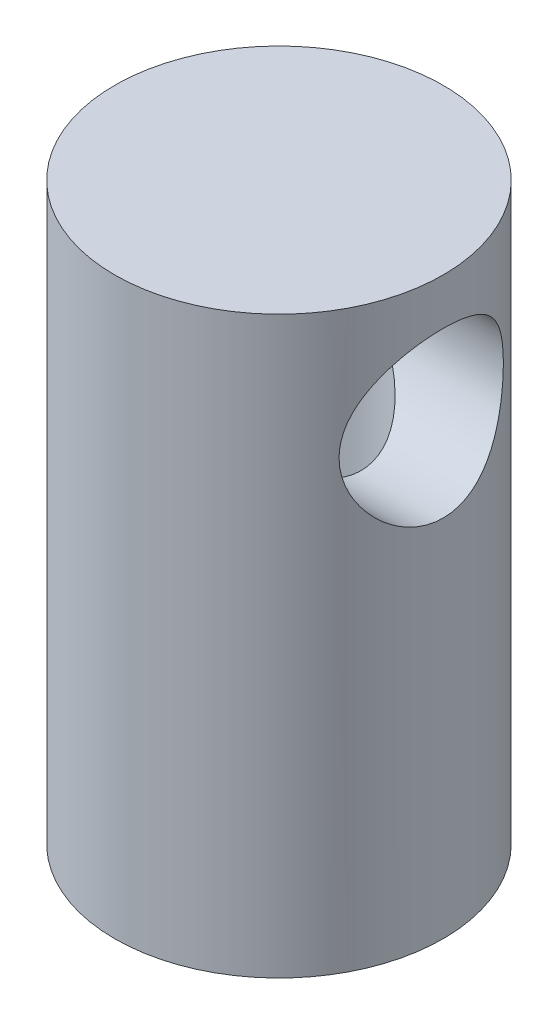
ISO-10303-21;
HEADER;
FILE_DESCRIPTION(('STEP AP214'),'2;1');
FILE_NAME('part.step','',(''),(''),'','','');
FILE_SCHEMA(('AUTOMOTIVE_DESIGN { 1 0 10303 214 1 1 1 1 }'));
ENDSEC;
DATA;
#1=APPLICATION_CONTEXT('core data for automotive mechanical design processes');
#2=APPLICATION_PROTOCOL_DEFINITION('international standard','automotive_design',2000,#1);
#3=PRODUCT_CONTEXT('',#1,'mechanical');
#4=PRODUCT('Part','Part','',(#3));
#5=PRODUCT_RELATED_PRODUCT_CATEGORY('part','',(#4));
#6=PRODUCT_DEFINITION_FORMATION('','',#4);
#7=PRODUCT_DEFINITION_CONTEXT('part definition',#1,'design');
#8=PRODUCT_DEFINITION('design','',#6,#7);
#9=PRODUCT_DEFINITION_SHAPE('','',#8);
#10=(LENGTH_UNIT() NAMED_UNIT(*) SI_UNIT(.MILLI.,.METRE.));
#11=(NAMED_UNIT(*) PLANE_ANGLE_UNIT() SI_UNIT($,.RADIAN.));
#12=(NAMED_UNIT(*) SI_UNIT($,.STERADIAN.) SOLID_ANGLE_UNIT());
#13=UNCERTAINTY_MEASURE_WITH_UNIT(LENGTH_MEASURE(1.E-05),#10,'distance_accuracy_value','');
#14=(GEOMETRIC_REPRESENTATION_CONTEXT(3) GLOBAL_UNCERTAINTY_ASSIGNED_CONTEXT((#13)) GLOBAL_UNIT_ASSIGNED_CONTEXT((#10,
#11,#12)) REPRESENTATION_CONTEXT('',''));
#15=CARTESIAN_POINT('',(0.,0.,0.));
#16=DIRECTION('',(0.,0.,1.));
#17=DIRECTION('',(1.,0.,0.));
#18=AXIS2_PLACEMENT_3D('',#15,#16,#17);
#19=CARTESIAN_POINT('',(0.,21.,0.));
#20=DIRECTION('',(0.,-1.,0.));
#21=DIRECTION('',(0.,0.,-1.));
#22=AXIS2_PLACEMENT_3D('',#19,#20,#21);
#23=CYLINDRICAL_SURFACE('',#22,6.);
#24=CARTESIAN_POINT('',(0.,21.,0.));
#25=DIRECTION('',(0.,1.,0.));
#26=DIRECTION('',(0.,0.,1.));
#27=AXIS2_PLACEMENT_3D('',#24,#25,#26);
#28=CIRCLE('',#27,6.);
#29=CARTESIAN_POINT('',(0.,21.,6.));
#30=VERTEX_POINT('',#29);
#31=EDGE_CURVE('E63',#30,#30,#28,.T.);
#32=ORIENTED_EDGE('',*,*,#31,.F.);
#33=EDGE_LOOP('',(#32));
#34=FACE_BOUND('',#33,.T.);
#35=CARTESIAN_POINT('',(0.,0.,0.));
#36=DIRECTION('',(0.,1.,0.));
#37=DIRECTION('',(0.,0.,1.));
#38=AXIS2_PLACEMENT_3D('',#35,#36,#37);
#39=CIRCLE('',#38,6.);
#40=CARTESIAN_POINT('',(0.,0.,6.));
#41=VERTEX_POINT('',#40);
#42=EDGE_CURVE('E75',#41,#41,#39,.T.);
#43=ORIENTED_EDGE('',*,*,#42,.T.);
#44=EDGE_LOOP('',(#43));
#45=FACE_BOUND('',#44,.T.);
#46=CARTESIAN_POINT('',(-5.19615242270663,16.3094313476554,3.));
#47=CARTESIAN_POINT('',(-5.19615338151414,16.3876315809145,2.99999910875738));
#48=CARTESIAN_POINT('',(-5.19792581191127,16.46584134612,2.99693611207795));
#49=CARTESIAN_POINT('',(-5.20493931657122,16.6216394227975,2.98473565374509));
#50=CARTESIAN_POINT('',(-5.21018200566082,16.6992274279239,2.97559536411629));
#51=CARTESIAN_POINT('',(-5.23088200558207,16.9303753619019,2.9391691225804));
#52=CARTESIAN_POINT('',(-5.25131076607215,17.0821822581887,2.902878058149));
#53=CARTESIAN_POINT('',(-5.30247746927539,17.375822981179,2.80829998089522));
#54=CARTESIAN_POINT('',(-5.33316051577918,17.5177051494063,2.75012989346617));
#55=CARTESIAN_POINT('',(-5.40128072966972,17.7896941093563,2.61380253964662));
#56=CARTESIAN_POINT('',(-5.43871826241347,17.9198002635304,2.53564419197537));
#57=CARTESIAN_POINT('',(-5.51990583559837,18.1763514938032,2.35399963256537));
#58=CARTESIAN_POINT('',(-5.5639218457163,18.3016095498114,2.24895611137364));
#59=CARTESIAN_POINT('',(-5.65115954702499,18.533655717345,2.01976141989962));
#60=CARTESIAN_POINT('',(-5.6943808324562,18.6404346159121,1.89560077655245));
#61=CARTESIAN_POINT('',(-5.77864428988887,18.8395330353878,1.62146869109162));
#62=CARTESIAN_POINT('',(-5.81934318752245,18.9303927135827,1.47032156718994));
#63=CARTESIAN_POINT('',(-5.89052268800541,19.0848538450835,1.1524710796464));
#64=CARTESIAN_POINT('',(-5.92100973690811,19.148472500902,0.985777614653094));
#65=CARTESIAN_POINT('',(-5.96641383603058,19.2419453456446,0.654134831556287));
#66=CARTESIAN_POINT('',(-5.98228440595573,19.2738799273035,0.489905370480169));
#67=CARTESIAN_POINT('',(-6.00022751605263,19.3099297030995,0.157711887079233));
#68=CARTESIAN_POINT('',(-6.00230840492438,19.3140617297877,-0.0102498138110356));
#69=CARTESIAN_POINT('',(-5.9928894562274,19.2951913150206,-0.329497576667919));
#70=CARTESIAN_POINT('',(-5.98255487247965,19.2745172595774,-0.480963609704589));
#71=CARTESIAN_POINT('',(-5.9512273620779,19.210788857459,-0.77794130357984));
#72=CARTESIAN_POINT('',(-5.93023363786807,19.1677328360776,-0.923452517976628));
#73=CARTESIAN_POINT('',(-5.87914748253371,19.0601834918859,-1.20692822064062));
#74=CARTESIAN_POINT('',(-5.8489331854518,18.9954018164548,-1.34476044303001));
#75=CARTESIAN_POINT('',(-5.78212944004645,18.8466416909475,-1.60793023199368));
#76=CARTESIAN_POINT('',(-5.74553771044373,18.7626563681458,-1.73326330217191));
#77=CARTESIAN_POINT('',(-5.66533158492101,18.5687428737159,-1.98052168794677));
#78=CARTESIAN_POINT('',(-5.62138031742825,18.4571128370138,-2.10100497271934));
#79=CARTESIAN_POINT('',(-5.53363118085844,18.2156716057466,-2.32231036115798));
#80=CARTESIAN_POINT('',(-5.48983345502612,18.0858465537598,-2.42311733790258));
#81=CARTESIAN_POINT('',(-5.40432084665524,17.8014492043147,-2.6085269546345));
#82=CARTESIAN_POINT('',(-5.36291485750666,17.6458289120095,-2.691694028528));
#83=CARTESIAN_POINT('',(-5.30915194408666,17.4018682930437,-2.79542837524198));
#84=CARTESIAN_POINT('',(-5.29261946495429,17.3187750372507,-2.82650797342001));
#85=CARTESIAN_POINT('',(-5.26298473463269,17.149622744621,-2.88131297532033));
#86=CARTESIAN_POINT('',(-5.24988036897854,17.0635655731807,-2.90504291399185));
#87=CARTESIAN_POINT('',(-5.22855455988393,16.8960597274314,-2.94323927983804));
#88=CARTESIAN_POINT('',(-5.22002982263214,16.8147819220176,-2.95828810706486));
#89=CARTESIAN_POINT('',(-5.2067273715729,16.6509961089896,-2.98163903200842));
#90=CARTESIAN_POINT('',(-5.20194770920408,16.5684887639071,-2.98994463830254));
#91=CARTESIAN_POINT('',(-5.19633662863607,16.4029603408527,-2.99968663811345));
#92=CARTESIAN_POINT('',(-5.19550374026212,16.3199394657118,-3.00112558946313));
#93=CARTESIAN_POINT('',(-5.19780953199967,16.1541448868908,-2.99712742537403));
#94=CARTESIAN_POINT('',(-5.20094794403249,16.0713711669049,-2.99169077406597));
#95=CARTESIAN_POINT('',(-5.21504493010247,15.8425722116128,-2.96710135231213));
#96=CARTESIAN_POINT('',(-5.23019160660498,15.6975205373922,-2.9405616310018));
#97=CARTESIAN_POINT('',(-5.27081666384497,15.4143004368586,-2.86709067362229));
#98=CARTESIAN_POINT('',(-5.29629839028765,15.2761342558252,-2.82015283383764));
#99=CARTESIAN_POINT('',(-5.35608780273032,15.0032052437355,-2.70494224478442));
#100=CARTESIAN_POINT('',(-5.3907496041273,14.8688964197513,-2.63578205088436));
#101=CARTESIAN_POINT('',(-5.46468327792416,14.6130214092894,-2.47886133231338));
#102=CARTESIAN_POINT('',(-5.50395751387985,14.491461816844,-2.39109125263821));
#103=CARTESIAN_POINT('',(-5.58864005140301,14.2484957210236,-2.18651145695799));
#104=CARTESIAN_POINT('',(-5.63419752084737,14.1290400767554,-2.067435804994));
#105=CARTESIAN_POINT('',(-5.72202702310923,13.9111944523606,-1.8102134981498));
#106=CARTESIAN_POINT('',(-5.76429794308224,13.8128115879799,-1.67206042712515));
#107=CARTESIAN_POINT('',(-5.84224085806641,13.6377102200818,-1.37560608443379));
#108=CARTESIAN_POINT('',(-5.87770925226882,13.5616320057724,-1.21686929217556));
#109=CARTESIAN_POINT('',(-5.93650064667293,13.4380176233448,-0.886567094469552));
#110=CARTESIAN_POINT('',(-5.95983430919532,13.3904563928135,-0.715013103124011));
#111=CARTESIAN_POINT('',(-5.9900252464518,13.3293256558063,-0.380939047947201));
#112=CARTESIAN_POINT('',(-5.99819783930701,13.3130377120947,-0.219034335650394));
#113=CARTESIAN_POINT('',(-6.00126390919338,13.3069015592219,0.105377961951196));
#114=CARTESIAN_POINT('',(-5.99616203476053,13.3170440944723,0.267885316317457));
#115=CARTESIAN_POINT('',(-5.97401907190636,13.3616805377889,0.577613962536138));
#116=CARTESIAN_POINT('',(-5.95778686442443,13.3945257853211,0.725136901247722));
#117=CARTESIAN_POINT('',(-5.91576278551446,13.4814124556875,1.01233790874441));
#118=CARTESIAN_POINT('',(-5.88996954319456,13.5354569181979,1.15201484923628));
#119=CARTESIAN_POINT('',(-5.829778017116,13.6656120763442,1.42627001605163));
#120=CARTESIAN_POINT('',(-5.79505887623287,13.7425676891917,1.56037465678411));
#121=CARTESIAN_POINT('',(-5.72064363382009,13.915306769069,1.81432469711303));
#122=CARTESIAN_POINT('',(-5.6809452494399,14.0110988836442,1.93416350676913));
#123=CARTESIAN_POINT('',(-5.59585978819439,14.229816070139,2.16873884087782));
#124=CARTESIAN_POINT('',(-5.55029975504518,14.354492668429,2.28178066887875));
#125=CARTESIAN_POINT('',(-5.46188649509677,14.6218096757256,2.48600225783028));
#126=CARTESIAN_POINT('',(-5.41903568750872,14.7644658086865,2.57716267726705));
#127=CARTESIAN_POINT('',(-5.36004774906988,14.9919631409572,2.69665559342489));
#128=CARTESIAN_POINT('',(-5.34101219148464,15.0714071486379,2.73405408762355));
#129=CARTESIAN_POINT('',(-5.30572783063718,15.2337846306642,2.80191257626505));
#130=CARTESIAN_POINT('',(-5.28947759301443,15.3167162814034,2.83237614466584));
#131=CARTESIAN_POINT('',(-5.26045215868185,15.4852760800252,2.88592624586958));
#132=CARTESIAN_POINT('',(-5.24766803509091,15.5708966548968,2.90903175649394));
#133=CARTESIAN_POINT('',(-5.22608869625112,15.7442866029697,2.9476242805163));
#134=CARTESIAN_POINT('',(-5.21729069243665,15.8320544285761,2.96311662049621));
#135=CARTESIAN_POINT('',(-5.20588528016133,15.9848301654154,2.9830938122572));
#136=CARTESIAN_POINT('',(-5.20224442588138,16.0495261565624,2.9894274622838));
#137=CARTESIAN_POINT('',(-5.19737751744686,16.1792896644551,2.99788106792142));
#138=CARTESIAN_POINT('',(-5.1961516248372,16.244357205763,3.00000074164547));
#139=CARTESIAN_POINT('',(-5.19615242270663,16.3094313476554,3.));
#140=B_SPLINE_CURVE_WITH_KNOTS('',3,(#46,#47,#48,#49,#50,#51,#52,#53,#54,#55,#56,#57,#58,#59,
#60,#61,#62,#63,#64,#65,#66,#67,#68,#69,#70,#71,#72,#73,#74,#75,#76,#77,#78,#79,#80,#81,#82,#83,
#84,#85,#86,#87,#88,#89,#90,#91,#92,#93,#94,#95,#96,#97,#98,#99,#100,#101,#102,#103,#104,#105,
#106,#107,#108,#109,#110,#111,#112,#113,#114,#115,#116,#117,#118,#119,#120,#121,#122,#123,#124,
#125,#126,#127,#128,#129,#130,#131,#132,#133,#134,#135,#136,#137,#138,#139),.UNSPECIFIED.,.T.,
.F.,(4,2,2,2,2,2,2,2,2,2,2,2,2,2,2,2,2,2,2,2,2,2,2,2,2,2,2,2,2,2,2,2,2,2,2,2,2,2,2,2,2,2,2,2,2,
2,4),(0.,0.23452943073389,0.469168072604263,0.938850383294531,1.40605749261242,1.87328988121657,
2.37905864237582,2.88507883741224,3.42520847204402,3.96499651379784,4.46637625391917,
4.96745241546231,5.42495462941727,5.88249108040477,6.34635774681552,6.81039068538927,
7.31828744858784,7.82657315225867,8.36713695676456,8.63752916119813,8.90775419202327,
9.15669600787592,9.40550821320572,9.65422772860784,9.90293045534218,10.3454331624118,
10.7880792327729,11.2512265518736,11.7146122462924,12.2364099671094,12.7583836090371,
13.29413310208,13.8294110539541,14.3155757713756,14.8015702635101,15.2555404058358,
15.7095756650514,16.1830301812751,16.6567025627126,17.177514915193,17.6987859450456,
17.9680115893229,18.2370981707631,18.5054849980179,18.7736837791728,18.9688338446807,
19.1639969639894),.UNSPECIFIED.);
#141=CARTESIAN_POINT('',(-5.19615242270663,16.3094313476554,3.));
#142=VERTEX_POINT('',#141);
#143=EDGE_CURVE('E70',#142,#142,#140,.T.);
#144=ORIENTED_EDGE('',*,*,#143,.F.);
#145=EDGE_LOOP('',(#144));
#146=FACE_BOUND('',#145,.T.);
#147=CARTESIAN_POINT('',(5.19615242270663,16.3094313476554,3.));
#148=CARTESIAN_POINT('',(5.19615338151414,16.2312311143963,2.99999910875738));
#149=CARTESIAN_POINT('',(5.19792581191126,16.1530213491909,2.99693611207795));
#150=CARTESIAN_POINT('',(5.20493931657122,15.9972232725134,2.98473565374509));
#151=CARTESIAN_POINT('',(5.21018200566082,15.9196352673869,2.97559536411629));
#152=CARTESIAN_POINT('',(5.23088200558207,15.688487333409,2.9391691225804));
#153=CARTESIAN_POINT('',(5.25131076607215,15.5366804371222,2.902878058149));
#154=CARTESIAN_POINT('',(5.30247746927539,15.2430397141319,2.80829998089522));
#155=CARTESIAN_POINT('',(5.33316051577918,15.1011575459045,2.75012989346617));
#156=CARTESIAN_POINT('',(5.40128072966972,14.8291685859546,2.61380253964662));
#157=CARTESIAN_POINT('',(5.43871826241347,14.6990624317805,2.53564419197538));
#158=CARTESIAN_POINT('',(5.51990583559837,14.4425112015077,2.35399963256537));
#159=CARTESIAN_POINT('',(5.56392184571631,14.3172531454995,2.24895611137363));
#160=CARTESIAN_POINT('',(5.651159547025,14.0852069779659,2.01976141989962));
#161=CARTESIAN_POINT('',(5.6943808324562,13.9784280793987,1.89560077655245));
#162=CARTESIAN_POINT('',(5.77864428988887,13.7793296599231,1.62146869109162));
#163=CARTESIAN_POINT('',(5.81934318752245,13.6884699817282,1.47032156718994));
#164=CARTESIAN_POINT('',(5.89052268800541,13.5340088502274,1.15247107964639));
#165=CARTESIAN_POINT('',(5.92100973690811,13.4703901944089,0.985777614653093));
#166=CARTESIAN_POINT('',(5.96641383603058,13.3769173496663,0.654134831556286));
#167=CARTESIAN_POINT('',(5.98228440595573,13.3449827680074,0.489905370480168));
#168=CARTESIAN_POINT('',(6.00022751605263,13.3089329922114,0.157711887079233));
#169=CARTESIAN_POINT('',(6.00230840492438,13.3048009655232,-0.0102498138110356));
#170=CARTESIAN_POINT('',(5.9928894562274,13.3236713802902,-0.329497576667918));
#171=CARTESIAN_POINT('',(5.98255487247965,13.3443454357335,-0.480963609704588));
#172=CARTESIAN_POINT('',(5.9512273620779,13.4080738378519,-0.77794130357984));
#173=CARTESIAN_POINT('',(5.93023363786807,13.4511298592333,-0.923452517976629));
#174=CARTESIAN_POINT('',(5.87914748253371,13.558679203425,-1.20692822064062));
#175=CARTESIAN_POINT('',(5.8489331854518,13.6234608788561,-1.34476044303001));
#176=CARTESIAN_POINT('',(5.78212944004645,13.7722210043634,-1.60793023199368));
#177=CARTESIAN_POINT('',(5.74553771044373,13.8562063271651,-1.73326330217191));
#178=CARTESIAN_POINT('',(5.66533158492101,14.050119821595,-1.98052168794677));
#179=CARTESIAN_POINT('',(5.62138031742825,14.1617498582971,-2.10100497271934));
#180=CARTESIAN_POINT('',(5.53363118085844,14.4031910895643,-2.32231036115798));
#181=CARTESIAN_POINT('',(5.48983345502612,14.5330161415511,-2.42311733790258));
#182=CARTESIAN_POINT('',(5.40432084665524,14.8174134909962,-2.6085269546345));
#183=CARTESIAN_POINT('',(5.36291485750666,14.9730337833014,-2.691694028528));
#184=CARTESIAN_POINT('',(5.30915194408666,15.2169944022672,-2.79542837524198));
#185=CARTESIAN_POINT('',(5.29261946495429,15.3000876580602,-2.82650797342001));
#186=CARTESIAN_POINT('',(5.26298473463269,15.4692399506899,-2.88131297532033));
#187=CARTESIAN_POINT('',(5.24988036897854,15.5552971221302,-2.90504291399185));
#188=CARTESIAN_POINT('',(5.22855455988393,15.7228029678795,-2.94323927983804));
#189=CARTESIAN_POINT('',(5.22002982263213,15.8040807732933,-2.95828810706486));
#190=CARTESIAN_POINT('',(5.2067273715729,15.9678665863213,-2.98163903200842));
#191=CARTESIAN_POINT('',(5.20194770920408,16.0503739314038,-2.98994463830254));
#192=CARTESIAN_POINT('',(5.19633662863607,16.2159023544581,-2.99968663811345));
#193=CARTESIAN_POINT('',(5.19550374026212,16.2989232295991,-3.00112558946313));
#194=CARTESIAN_POINT('',(5.19780953199966,16.4647178084201,-2.99712742537403));
#195=CARTESIAN_POINT('',(5.20094794403249,16.547491528406,-2.99169077406597));
#196=CARTESIAN_POINT('',(5.21504493010247,16.7762904836981,-2.96710135231213));
#197=CARTESIAN_POINT('',(5.23019160660498,16.9213421579187,-2.9405616310018));
#198=CARTESIAN_POINT('',(5.27081666384497,17.2045622584523,-2.86709067362229));
#199=CARTESIAN_POINT('',(5.29629839028765,17.3427284394857,-2.82015283383764));
#200=CARTESIAN_POINT('',(5.35608780273032,17.6156574515754,-2.70494224478443));
#201=CARTESIAN_POINT('',(5.3907496041273,17.7499662755595,-2.63578205088436));
#202=CARTESIAN_POINT('',(5.46468327792416,18.0058412860215,-2.47886133231338));
#203=CARTESIAN_POINT('',(5.50395751387985,18.1274008784669,-2.39109125263821));
#204=CARTESIAN_POINT('',(5.58864005140301,18.3703669742873,-2.18651145695799));
#205=CARTESIAN_POINT('',(5.63419752084737,18.4898226185555,-2.067435804994));
#206=CARTESIAN_POINT('',(5.72202702310923,18.7076682429503,-1.8102134981498));
#207=CARTESIAN_POINT('',(5.76429794308224,18.8060511073309,-1.67206042712515));
#208=CARTESIAN_POINT('',(5.84224085806641,18.9811524752291,-1.37560608443379));
#209=CARTESIAN_POINT('',(5.87770925226882,19.0572306895385,-1.21686929217556));
#210=CARTESIAN_POINT('',(5.93650064667293,19.180845071966,-0.886567094469554));
#211=CARTESIAN_POINT('',(5.95983430919532,19.2284063024974,-0.715013103124012));
#212=CARTESIAN_POINT('',(5.9900252464518,19.2895370395046,-0.380939047947202));
#213=CARTESIAN_POINT('',(5.99819783930701,19.3058249832162,-0.219034335650396));
#214=CARTESIAN_POINT('',(6.00126390919338,19.311961136089,0.105377961951195));
#215=CARTESIAN_POINT('',(5.99616203476053,19.3018186008386,0.267885316317457));
#216=CARTESIAN_POINT('',(5.97401907190636,19.2571821575219,0.577613962536138));
#217=CARTESIAN_POINT('',(5.95778686442443,19.2243369099898,0.725136901247721));
#218=CARTESIAN_POINT('',(5.91576278551446,19.1374502396234,1.01233790874441));
#219=CARTESIAN_POINT('',(5.88996954319456,19.083405777113,1.15201484923628));
#220=CARTESIAN_POINT('',(5.829778017116,18.9532506189667,1.42627001605163));
#221=CARTESIAN_POINT('',(5.79505887623287,18.8762950061192,1.56037465678411));
#222=CARTESIAN_POINT('',(5.72064363382009,18.7035559262419,1.81432469711303));
#223=CARTESIAN_POINT('',(5.6809452494399,18.6077638116667,1.93416350676913));
#224=CARTESIAN_POINT('',(5.59585978819439,18.3890466251719,2.16873884087782));
#225=CARTESIAN_POINT('',(5.55029975504518,18.2643700268818,2.28178066887875));
#226=CARTESIAN_POINT('',(5.46188649509677,17.9970530195853,2.48600225783028));
#227=CARTESIAN_POINT('',(5.41903568750872,17.8543968866244,2.57716267726705));
#228=CARTESIAN_POINT('',(5.36004774906988,17.6268995543537,2.69665559342489));
#229=CARTESIAN_POINT('',(5.34101219148464,17.547455546673,2.73405408762355));
#230=CARTESIAN_POINT('',(5.30572783063718,17.3850780646467,2.80191257626505));
#231=CARTESIAN_POINT('',(5.28947759301443,17.3021464139074,2.83237614466584));
#232=CARTESIAN_POINT('',(5.26045215868185,17.1335866152857,2.88592624586958));
#233=CARTESIAN_POINT('',(5.24766803509091,17.0479660404141,2.90903175649394));
#234=CARTESIAN_POINT('',(5.22608869625113,16.8745760923412,2.9476242805163));
#235=CARTESIAN_POINT('',(5.21729069243665,16.7868082667348,2.96311662049621));
#236=CARTESIAN_POINT('',(5.20588528016133,16.6340325298955,2.9830938122572));
#237=CARTESIAN_POINT('',(5.20224442588138,16.5693365387485,2.9894274622838));
#238=CARTESIAN_POINT('',(5.19737751744686,16.4395730308558,2.99788106792142));
#239=CARTESIAN_POINT('',(5.1961516248372,16.3745054895478,3.00000074164547));
#240=CARTESIAN_POINT('',(5.19615242270663,16.3094313476554,3.));
#241=B_SPLINE_CURVE_WITH_KNOTS('',3,(#147,#148,#149,#150,#151,#152,#153,#154,#155,#156,#157,
#158,#159,#160,#161,#162,#163,#164,#165,#166,#167,#168,#169,#170,#171,#172,#173,#174,#175,#176,
#177,#178,#179,#180,#181,#182,#183,#184,#185,#186,#187,#188,#189,#190,#191,#192,#193,#194,#195,
#196,#197,#198,#199,#200,#201,#202,#203,#204,#205,#206,#207,#208,#209,#210,#211,#212,#213,#214,
#215,#216,#217,#218,#219,#220,#221,#222,#223,#224,#225,#226,#227,#228,#229,#230,#231,#232,#233,
#234,#235,#236,#237,#238,#239,#240),.UNSPECIFIED.,.T.,.F.,(4,2,2,2,2,2,2,2,2,2,2,2,2,2,2,2,2,2,
2,2,2,2,2,2,2,2,2,2,2,2,2,2,2,2,2,2,2,2,2,2,2,2,2,2,2,2,4),(0.,0.23452943073389,
0.469168072604263,0.938850383294531,1.40605749261242,1.87328988121656,2.37905864237582,
2.88507883741225,3.42520847204402,3.96499651379785,4.46637625391917,4.96745241546231,
5.42495462941727,5.88249108040477,6.34635774681552,6.81039068538927,7.31828744858784,
7.82657315225867,8.36713695676457,8.63752916119814,8.90775419202327,9.15669600787593,
9.40550821320573,9.65422772860785,9.90293045534218,10.3454331624118,10.7880792327729,
11.2512265518736,11.7146122462924,12.2364099671094,12.7583836090371,13.29413310208,
13.8294110539541,14.3155757713756,14.8015702635101,15.2555404058358,15.7095756650514,
16.1830301812752,16.6567025627126,17.177514915193,17.6987859450456,17.9680115893229,
18.2370981707631,18.5054849980179,18.7736837791728,18.9688338446807,19.1639969639894),.UNSPECIFIED.);
#242=CARTESIAN_POINT('',(5.19615242270663,16.3094313476554,3.));
#243=VERTEX_POINT('',#242);
#244=EDGE_CURVE('E77',#243,#243,#241,.T.);
#245=ORIENTED_EDGE('',*,*,#244,.F.);
#246=EDGE_LOOP('',(#245));
#247=FACE_BOUND('',#246,.T.);
#248=ADVANCED_FACE('F34',(#34,#45,#146,#247),#23,.T.);
#249=CARTESIAN_POINT('',(0.,15.,0.));
#250=DIRECTION('',(0.,-1.,0.));
#251=DIRECTION('',(0.,0.,-1.));
#252=AXIS2_PLACEMENT_3D('',#249,#250,#251);
#253=CYLINDRICAL_SURFACE('',#252,3.);
#254=CARTESIAN_POINT('',(0.,0.,0.));
#255=DIRECTION('',(0.,-1.,0.));
#256=DIRECTION('',(0.,0.,-1.));
#257=AXIS2_PLACEMENT_3D('',#254,#255,#256);
#258=CIRCLE('',#257,3.);
#259=CARTESIAN_POINT('',(0.,0.,-3.));
#260=VERTEX_POINT('',#259);
#261=EDGE_CURVE('E73',#260,#260,#258,.T.);
#262=ORIENTED_EDGE('',*,*,#261,.T.);
#263=EDGE_LOOP('',(#262));
#264=FACE_BOUND('',#263,.T.);
#265=CARTESIAN_POINT('',(0.,16.3094313476554,0.));
#266=DIRECTION('',(-0.707106781186547,-0.707106781186547,0.));
#267=DIRECTION('',(0.707106781186547,-0.707106781186547,0.));
#268=AXIS2_PLACEMENT_3D('',#265,#266,#267);
#269=ELLIPSE('',#268,4.24264068711928,3.);
#270=CARTESIAN_POINT('',(1.30943134765544,15.,-2.69914607714685));
#271=VERTEX_POINT('',#270);
#272=CARTESIAN_POINT('',(1.30943134765544,15.,2.69914607714685));
#273=VERTEX_POINT('',#272);
#274=EDGE_CURVE('E54',#271,#273,#269,.T.);
#275=ORIENTED_EDGE('',*,*,#274,.F.);
#276=CARTESIAN_POINT('',(0.,15.,0.));
#277=DIRECTION('',(0.,-1.,0.));
#278=DIRECTION('',(0.,0.,-1.));
#279=AXIS2_PLACEMENT_3D('',#276,#277,#278);
#280=CIRCLE('',#279,3.);
#281=CARTESIAN_POINT('',(-1.30943134765544,15.,-2.69914607714685));
#282=VERTEX_POINT('',#281);
#283=EDGE_CURVE('E67',#282,#271,#280,.T.);
#284=ORIENTED_EDGE('',*,*,#283,.F.);
#285=CARTESIAN_POINT('',(0.,16.3094313476554,0.));
#286=DIRECTION('',(0.707106781186547,-0.707106781186547,0.));
#287=DIRECTION('',(-0.707106781186547,-0.707106781186547,0.));
#288=AXIS2_PLACEMENT_3D('',#285,#286,#287);
#289=ELLIPSE('',#288,4.24264068711928,3.);
#290=CARTESIAN_POINT('',(-1.30943134765544,15.,2.69914607714685));
#291=VERTEX_POINT('',#290);
#292=EDGE_CURVE('E49',#291,#282,#289,.T.);
#293=ORIENTED_EDGE('',*,*,#292,.F.);
#294=EDGE_CURVE('E69',#273,#291,#280,.T.);
#295=ORIENTED_EDGE('',*,*,#294,.F.);
#296=EDGE_LOOP('',(#275,#284,#293,#295));
#297=FACE_BOUND('',#296,.T.);
#298=ADVANCED_FACE('F66',(#264,#297),#253,.F.);
#299=CARTESIAN_POINT('',(0.,15.,0.));
#300=DIRECTION('',(0.,-1.,0.));
#301=DIRECTION('',(0.,0.,-1.));
#302=AXIS2_PLACEMENT_3D('',#299,#300,#301);
#303=PLANE('',#302);
#304=ORIENTED_EDGE('',*,*,#294,.T.);
#305=DIRECTION('',(-1.,0.,0.));
#306=VECTOR('',#305,1.);
#307=CARTESIAN_POINT('',(10.,15.,2.69914607714685));
#308=LINE('',#307,#306);
#309=EDGE_CURVE('E11',#291,#273,#308,.F.);
#310=ORIENTED_EDGE('',*,*,#309,.T.);
#311=EDGE_LOOP('',(#304,#310));
#312=FACE_BOUND('',#311,.T.);
#313=ADVANCED_FACE('F110',(#312),#303,.T.);
#314=ORIENTED_EDGE('',*,*,#283,.T.);
#315=DIRECTION('',(-1.,0.,0.));
#316=VECTOR('',#315,1.);
#317=CARTESIAN_POINT('',(10.,15.,-2.69914607714685));
#318=LINE('',#317,#316);
#319=EDGE_CURVE('E42',#271,#282,#318,.T.);
#320=ORIENTED_EDGE('',*,*,#319,.T.);
#321=EDGE_LOOP('',(#314,#320));
#322=FACE_BOUND('',#321,.T.);
#323=ADVANCED_FACE('F72',(#322),#303,.T.);
#324=CARTESIAN_POINT('',(0.,21.,0.));
#325=DIRECTION('',(0.,1.,0.));
#326=DIRECTION('',(0.,0.,1.));
#327=AXIS2_PLACEMENT_3D('',#324,#325,#326);
#328=PLANE('',#327);
#329=ORIENTED_EDGE('',*,*,#31,.T.);
#330=EDGE_LOOP('',(#329));
#331=FACE_BOUND('',#330,.T.);
#332=ADVANCED_FACE('F95',(#331),#328,.T.);
#333=CARTESIAN_POINT('',(0.,0.,0.));
#334=DIRECTION('',(0.,1.,0.));
#335=DIRECTION('',(0.,0.,1.));
#336=AXIS2_PLACEMENT_3D('',#333,#334,#335);
#337=PLANE('',#336);
#338=ORIENTED_EDGE('',*,*,#261,.F.);
#339=EDGE_LOOP('',(#338));
#340=FACE_BOUND('',#339,.T.);
#341=ORIENTED_EDGE('',*,*,#42,.F.);
#342=EDGE_LOOP('',(#341));
#343=FACE_BOUND('',#342,.T.);
#344=ADVANCED_FACE('F93',(#340,#343),#337,.F.);
#345=CARTESIAN_POINT('',(10.,16.3094313476554,0.));
#346=DIRECTION('',(-1.,0.,0.));
#347=DIRECTION('',(0.,0.,1.));
#348=AXIS2_PLACEMENT_3D('',#345,#346,#347);
#349=CYLINDRICAL_SURFACE('',#348,3.);
#350=ORIENTED_EDGE('',*,*,#143,.T.);
#351=EDGE_LOOP('',(#350));
#352=FACE_BOUND('',#351,.T.);
#353=ORIENTED_EDGE('',*,*,#292,.T.);
#354=ORIENTED_EDGE('',*,*,#319,.F.);
#355=ORIENTED_EDGE('',*,*,#274,.T.);
#356=ORIENTED_EDGE('',*,*,#309,.F.);
#357=EDGE_LOOP('',(#353,#354,#355,#356));
#358=FACE_BOUND('',#357,.T.);
#359=ORIENTED_EDGE('',*,*,#244,.T.);
#360=EDGE_LOOP('',(#359));
#361=FACE_BOUND('',#360,.T.);
#362=ADVANCED_FACE('F58',(#352,#358,#361),#349,.F.);
#363=CLOSED_SHELL('',(#248,#298,#313,#323,#332,#344,#362));
#364=MANIFOLD_SOLID_BREP('B2',#363);
#365=ADVANCED_BREP_SHAPE_REPRESENTATION('',(#18,#364),#14);
#366=SHAPE_DEFINITION_REPRESENTATION(#9,#365);
ENDSEC;
END-ISO-10303-21;
